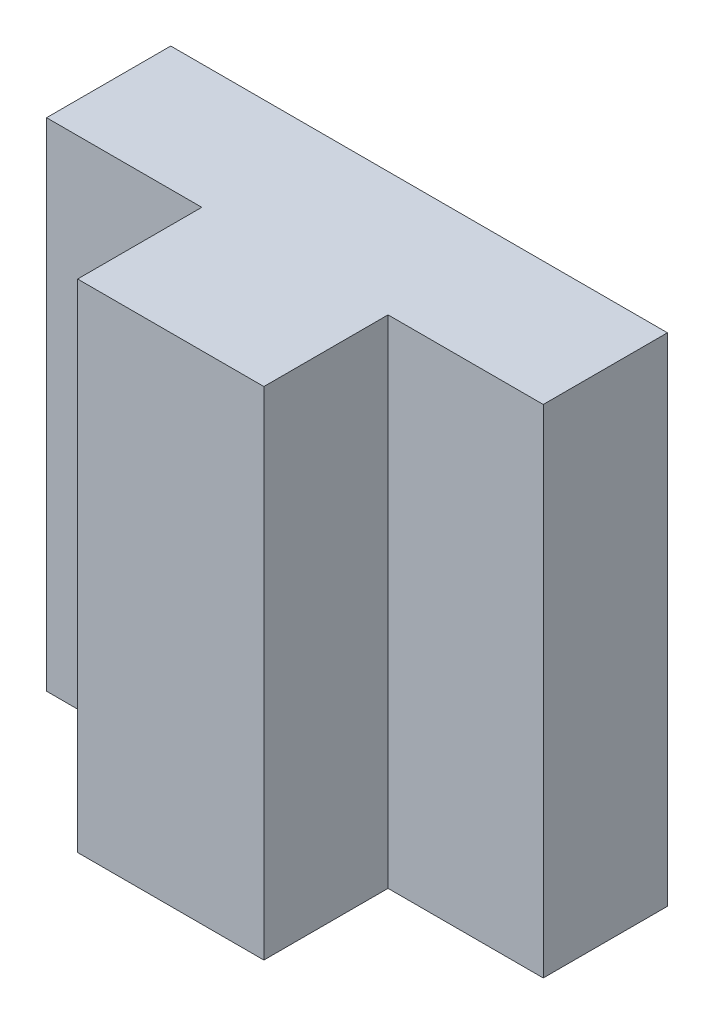
ISO-10303-21;
HEADER;
FILE_DESCRIPTION(('STEP AP214'),'2;1');
FILE_NAME('part.step','',(''),(''),'','','');
FILE_SCHEMA(('AUTOMOTIVE_DESIGN { 1 0 10303 214 1 1 1 1 }'));
ENDSEC;
DATA;
#1=APPLICATION_CONTEXT('core data for automotive mechanical design processes');
#2=APPLICATION_PROTOCOL_DEFINITION('international standard','automotive_design',2000,#1);
#3=PRODUCT_CONTEXT('',#1,'mechanical');
#4=PRODUCT('Part','Part','',(#3));
#5=PRODUCT_RELATED_PRODUCT_CATEGORY('part','',(#4));
#6=PRODUCT_DEFINITION_FORMATION('','',#4);
#7=PRODUCT_DEFINITION_CONTEXT('part definition',#1,'design');
#8=PRODUCT_DEFINITION('design','',#6,#7);
#9=PRODUCT_DEFINITION_SHAPE('','',#8);
#10=(LENGTH_UNIT() NAMED_UNIT(*) SI_UNIT(.MILLI.,.METRE.));
#11=(NAMED_UNIT(*) PLANE_ANGLE_UNIT() SI_UNIT($,.RADIAN.));
#12=(NAMED_UNIT(*) SI_UNIT($,.STERADIAN.) SOLID_ANGLE_UNIT());
#13=UNCERTAINTY_MEASURE_WITH_UNIT(LENGTH_MEASURE(1.E-05),#10,'distance_accuracy_value','');
#14=(GEOMETRIC_REPRESENTATION_CONTEXT(3) GLOBAL_UNCERTAINTY_ASSIGNED_CONTEXT((#13)) GLOBAL_UNIT_ASSIGNED_CONTEXT((#10,
#11,#12)) REPRESENTATION_CONTEXT('',''));
#15=CARTESIAN_POINT('',(0.,0.,0.));
#16=DIRECTION('',(0.,0.,1.));
#17=DIRECTION('',(1.,0.,0.));
#18=AXIS2_PLACEMENT_3D('',#15,#16,#17);
#19=CARTESIAN_POINT('',(0.,80.,0.));
#20=DIRECTION('',(1.,0.,0.));
#21=DIRECTION('',(0.,0.,-1.));
#22=AXIS2_PLACEMENT_3D('',#19,#20,#21);
#23=PLANE('',#22);
#24=DIRECTION('',(0.,0.,1.));
#25=VECTOR('',#24,1.);
#26=CARTESIAN_POINT('',(0.,0.,0.));
#27=LINE('',#26,#25);
#28=CARTESIAN_POINT('',(0.,0.,0.));
#29=VERTEX_POINT('',#28);
#30=CARTESIAN_POINT('',(0.,0.,20.));
#31=VERTEX_POINT('',#30);
#32=EDGE_CURVE('E129',#29,#31,#27,.T.);
#33=ORIENTED_EDGE('',*,*,#32,.T.);
#34=DIRECTION('',(0.,-1.,0.));
#35=VECTOR('',#34,1.);
#36=CARTESIAN_POINT('',(0.,80.,20.));
#37=LINE('',#36,#35);
#38=CARTESIAN_POINT('',(0.,80.,20.));
#39=VERTEX_POINT('',#38);
#40=EDGE_CURVE('E11',#39,#31,#37,.T.);
#41=ORIENTED_EDGE('',*,*,#40,.F.);
#42=DIRECTION('',(0.,0.,1.));
#43=VECTOR('',#42,1.);
#44=CARTESIAN_POINT('',(0.,80.,0.));
#45=LINE('',#44,#43);
#46=CARTESIAN_POINT('',(0.,80.,0.));
#47=VERTEX_POINT('',#46);
#48=EDGE_CURVE('E143',#47,#39,#45,.T.);
#49=ORIENTED_EDGE('',*,*,#48,.F.);
#50=DIRECTION('',(0.,-1.,0.));
#51=VECTOR('',#50,1.);
#52=CARTESIAN_POINT('',(0.,80.,0.));
#53=LINE('',#52,#51);
#54=EDGE_CURVE('E125',#47,#29,#53,.T.);
#55=ORIENTED_EDGE('',*,*,#54,.T.);
#56=EDGE_LOOP('',(#33,#41,#49,#55));
#57=FACE_BOUND('',#56,.T.);
#58=ADVANCED_FACE('F33',(#57),#23,.F.);
#59=CARTESIAN_POINT('',(0.,80.,20.));
#60=DIRECTION('',(0.,0.,-1.));
#61=DIRECTION('',(-1.,0.,0.));
#62=AXIS2_PLACEMENT_3D('',#59,#60,#61);
#63=PLANE('',#62);
#64=DIRECTION('',(1.,0.,0.));
#65=VECTOR('',#64,1.);
#66=CARTESIAN_POINT('',(0.,0.,20.));
#67=LINE('',#66,#65);
#68=CARTESIAN_POINT('',(25.,0.,20.));
#69=VERTEX_POINT('',#68);
#70=EDGE_CURVE('E132',#31,#69,#67,.T.);
#71=ORIENTED_EDGE('',*,*,#70,.T.);
#72=DIRECTION('',(0.,-1.,0.));
#73=VECTOR('',#72,1.);
#74=CARTESIAN_POINT('',(25.,80.,20.));
#75=LINE('',#74,#73);
#76=CARTESIAN_POINT('',(25.,80.,20.));
#77=VERTEX_POINT('',#76);
#78=EDGE_CURVE('E41',#77,#69,#75,.T.);
#79=ORIENTED_EDGE('',*,*,#78,.F.);
#80=DIRECTION('',(1.,0.,0.));
#81=VECTOR('',#80,1.);
#82=CARTESIAN_POINT('',(0.,80.,20.));
#83=LINE('',#82,#81);
#84=EDGE_CURVE('E92',#39,#77,#83,.T.);
#85=ORIENTED_EDGE('',*,*,#84,.F.);
#86=ORIENTED_EDGE('',*,*,#40,.T.);
#87=EDGE_LOOP('',(#71,#79,#85,#86));
#88=FACE_BOUND('',#87,.T.);
#89=ADVANCED_FACE('F178',(#88),#63,.F.);
#90=CARTESIAN_POINT('',(25.,80.,40.));
#91=DIRECTION('',(1.,0.,0.));
#92=DIRECTION('',(0.,0.,-1.));
#93=AXIS2_PLACEMENT_3D('',#90,#91,#92);
#94=PLANE('',#93);
#95=DIRECTION('',(0.,0.,1.));
#96=VECTOR('',#95,1.);
#97=CARTESIAN_POINT('',(25.,0.,40.));
#98=LINE('',#97,#96);
#99=CARTESIAN_POINT('',(25.,0.,40.));
#100=VERTEX_POINT('',#99);
#101=EDGE_CURVE('E134',#69,#100,#98,.T.);
#102=ORIENTED_EDGE('',*,*,#101,.T.);
#103=DIRECTION('',(0.,-1.,0.));
#104=VECTOR('',#103,1.);
#105=CARTESIAN_POINT('',(25.,80.,40.));
#106=LINE('',#105,#104);
#107=CARTESIAN_POINT('',(25.,80.,40.));
#108=VERTEX_POINT('',#107);
#109=EDGE_CURVE('E150',#108,#100,#106,.T.);
#110=ORIENTED_EDGE('',*,*,#109,.F.);
#111=DIRECTION('',(0.,0.,1.));
#112=VECTOR('',#111,1.);
#113=CARTESIAN_POINT('',(25.,80.,40.));
#114=LINE('',#113,#112);
#115=EDGE_CURVE('E158',#77,#108,#114,.T.);
#116=ORIENTED_EDGE('',*,*,#115,.F.);
#117=ORIENTED_EDGE('',*,*,#78,.T.);
#118=EDGE_LOOP('',(#102,#110,#116,#117));
#119=FACE_BOUND('',#118,.T.);
#120=ADVANCED_FACE('F156',(#119),#94,.F.);
#121=CARTESIAN_POINT('',(25.,80.,40.));
#122=DIRECTION('',(0.,0.,-1.));
#123=DIRECTION('',(-1.,0.,0.));
#124=AXIS2_PLACEMENT_3D('',#121,#122,#123);
#125=PLANE('',#124);
#126=DIRECTION('',(1.,0.,0.));
#127=VECTOR('',#126,1.);
#128=CARTESIAN_POINT('',(25.,0.,40.));
#129=LINE('',#128,#127);
#130=CARTESIAN_POINT('',(55.,0.,40.));
#131=VERTEX_POINT('',#130);
#132=EDGE_CURVE('E136',#100,#131,#129,.T.);
#133=ORIENTED_EDGE('',*,*,#132,.T.);
#134=DIRECTION('',(0.,-1.,0.));
#135=VECTOR('',#134,1.);
#136=CARTESIAN_POINT('',(55.,80.,40.));
#137=LINE('',#136,#135);
#138=CARTESIAN_POINT('',(55.,80.,40.));
#139=VERTEX_POINT('',#138);
#140=EDGE_CURVE('E147',#139,#131,#137,.T.);
#141=ORIENTED_EDGE('',*,*,#140,.F.);
#142=DIRECTION('',(1.,0.,0.));
#143=VECTOR('',#142,1.);
#144=CARTESIAN_POINT('',(25.,80.,40.));
#145=LINE('',#144,#143);
#146=EDGE_CURVE('E170',#108,#139,#145,.T.);
#147=ORIENTED_EDGE('',*,*,#146,.F.);
#148=ORIENTED_EDGE('',*,*,#109,.T.);
#149=EDGE_LOOP('',(#133,#141,#147,#148));
#150=FACE_BOUND('',#149,.T.);
#151=ADVANCED_FACE('F166',(#150),#125,.F.);
#152=CARTESIAN_POINT('',(55.,80.,40.));
#153=DIRECTION('',(-1.,0.,0.));
#154=DIRECTION('',(0.,0.,1.));
#155=AXIS2_PLACEMENT_3D('',#152,#153,#154);
#156=PLANE('',#155);
#157=DIRECTION('',(0.,0.,-1.));
#158=VECTOR('',#157,1.);
#159=CARTESIAN_POINT('',(55.,0.,40.));
#160=LINE('',#159,#158);
#161=CARTESIAN_POINT('',(55.,0.,20.));
#162=VERTEX_POINT('',#161);
#163=EDGE_CURVE('E138',#131,#162,#160,.T.);
#164=ORIENTED_EDGE('',*,*,#163,.T.);
#165=DIRECTION('',(0.,-1.,0.));
#166=VECTOR('',#165,1.);
#167=CARTESIAN_POINT('',(55.,80.,20.));
#168=LINE('',#167,#166);
#169=CARTESIAN_POINT('',(55.,80.,20.));
#170=VERTEX_POINT('',#169);
#171=EDGE_CURVE('E120',#170,#162,#168,.T.);
#172=ORIENTED_EDGE('',*,*,#171,.F.);
#173=DIRECTION('',(0.,0.,-1.));
#174=VECTOR('',#173,1.);
#175=CARTESIAN_POINT('',(55.,80.,40.));
#176=LINE('',#175,#174);
#177=EDGE_CURVE('E111',#139,#170,#176,.T.);
#178=ORIENTED_EDGE('',*,*,#177,.F.);
#179=ORIENTED_EDGE('',*,*,#140,.T.);
#180=EDGE_LOOP('',(#164,#172,#178,#179));
#181=FACE_BOUND('',#180,.T.);
#182=ADVANCED_FACE('F169',(#181),#156,.F.);
#183=CARTESIAN_POINT('',(80.,80.,20.));
#184=DIRECTION('',(0.,0.,-1.));
#185=DIRECTION('',(-1.,0.,0.));
#186=AXIS2_PLACEMENT_3D('',#183,#184,#185);
#187=PLANE('',#186);
#188=DIRECTION('',(1.,0.,0.));
#189=VECTOR('',#188,1.);
#190=CARTESIAN_POINT('',(80.,0.,20.));
#191=LINE('',#190,#189);
#192=CARTESIAN_POINT('',(80.,0.,20.));
#193=VERTEX_POINT('',#192);
#194=EDGE_CURVE('E119',#162,#193,#191,.T.);
#195=ORIENTED_EDGE('',*,*,#194,.T.);
#196=DIRECTION('',(0.,-1.,0.));
#197=VECTOR('',#196,1.);
#198=CARTESIAN_POINT('',(80.,80.,20.));
#199=LINE('',#198,#197);
#200=CARTESIAN_POINT('',(80.,80.,20.));
#201=VERTEX_POINT('',#200);
#202=EDGE_CURVE('E116',#201,#193,#199,.T.);
#203=ORIENTED_EDGE('',*,*,#202,.F.);
#204=DIRECTION('',(1.,0.,0.));
#205=VECTOR('',#204,1.);
#206=CARTESIAN_POINT('',(80.,80.,20.));
#207=LINE('',#206,#205);
#208=EDGE_CURVE('E105',#170,#201,#207,.T.);
#209=ORIENTED_EDGE('',*,*,#208,.F.);
#210=ORIENTED_EDGE('',*,*,#171,.T.);
#211=EDGE_LOOP('',(#195,#203,#209,#210));
#212=FACE_BOUND('',#211,.T.);
#213=ADVANCED_FACE('F117',(#212),#187,.F.);
#214=CARTESIAN_POINT('',(80.,80.,0.));
#215=DIRECTION('',(-1.,0.,0.));
#216=DIRECTION('',(0.,0.,1.));
#217=AXIS2_PLACEMENT_3D('',#214,#215,#216);
#218=PLANE('',#217);
#219=DIRECTION('',(0.,0.,-1.));
#220=VECTOR('',#219,1.);
#221=CARTESIAN_POINT('',(80.,0.,0.));
#222=LINE('',#221,#220);
#223=CARTESIAN_POINT('',(80.,0.,0.));
#224=VERTEX_POINT('',#223);
#225=EDGE_CURVE('E78',#193,#224,#222,.T.);
#226=ORIENTED_EDGE('',*,*,#225,.T.);
#227=DIRECTION('',(0.,-1.,0.));
#228=VECTOR('',#227,1.);
#229=CARTESIAN_POINT('',(80.,80.,0.));
#230=LINE('',#229,#228);
#231=CARTESIAN_POINT('',(80.,80.,0.));
#232=VERTEX_POINT('',#231);
#233=EDGE_CURVE('E121',#232,#224,#230,.T.);
#234=ORIENTED_EDGE('',*,*,#233,.F.);
#235=DIRECTION('',(0.,0.,-1.));
#236=VECTOR('',#235,1.);
#237=CARTESIAN_POINT('',(80.,80.,0.));
#238=LINE('',#237,#236);
#239=EDGE_CURVE('E109',#201,#232,#238,.T.);
#240=ORIENTED_EDGE('',*,*,#239,.F.);
#241=ORIENTED_EDGE('',*,*,#202,.T.);
#242=EDGE_LOOP('',(#226,#234,#240,#241));
#243=FACE_BOUND('',#242,.T.);
#244=ADVANCED_FACE('F123',(#243),#218,.F.);
#245=CARTESIAN_POINT('',(0.,80.,0.));
#246=DIRECTION('',(0.,0.,1.));
#247=DIRECTION('',(1.,0.,0.));
#248=AXIS2_PLACEMENT_3D('',#245,#246,#247);
#249=PLANE('',#248);
#250=DIRECTION('',(-1.,0.,0.));
#251=VECTOR('',#250,1.);
#252=CARTESIAN_POINT('',(0.,0.,0.));
#253=LINE('',#252,#251);
#254=EDGE_CURVE('E84',#224,#29,#253,.T.);
#255=ORIENTED_EDGE('',*,*,#254,.T.);
#256=ORIENTED_EDGE('',*,*,#54,.F.);
#257=DIRECTION('',(-1.,0.,0.));
#258=VECTOR('',#257,1.);
#259=CARTESIAN_POINT('',(0.,80.,0.));
#260=LINE('',#259,#258);
#261=EDGE_CURVE('E49',#232,#47,#260,.T.);
#262=ORIENTED_EDGE('',*,*,#261,.F.);
#263=ORIENTED_EDGE('',*,*,#233,.T.);
#264=EDGE_LOOP('',(#255,#256,#262,#263));
#265=FACE_BOUND('',#264,.T.);
#266=ADVANCED_FACE('F194',(#265),#249,.F.);
#267=CARTESIAN_POINT('',(0.,80.,0.));
#268=DIRECTION('',(0.,1.,0.));
#269=DIRECTION('',(0.,0.,1.));
#270=AXIS2_PLACEMENT_3D('',#267,#268,#269);
#271=PLANE('',#270);
#272=ORIENTED_EDGE('',*,*,#48,.T.);
#273=ORIENTED_EDGE('',*,*,#84,.T.);
#274=ORIENTED_EDGE('',*,*,#115,.T.);
#275=ORIENTED_EDGE('',*,*,#146,.T.);
#276=ORIENTED_EDGE('',*,*,#177,.T.);
#277=ORIENTED_EDGE('',*,*,#208,.T.);
#278=ORIENTED_EDGE('',*,*,#239,.T.);
#279=ORIENTED_EDGE('',*,*,#261,.T.);
#280=EDGE_LOOP('',(#272,#273,#274,#275,#276,#277,#278,#279));
#281=FACE_BOUND('',#280,.T.);
#282=ADVANCED_FACE('F107',(#281),#271,.T.);
#283=CARTESIAN_POINT('',(0.,0.,0.));
#284=DIRECTION('',(0.,1.,0.));
#285=DIRECTION('',(0.,0.,1.));
#286=AXIS2_PLACEMENT_3D('',#283,#284,#285);
#287=PLANE('',#286);
#288=ORIENTED_EDGE('',*,*,#32,.F.);
#289=ORIENTED_EDGE('',*,*,#254,.F.);
#290=ORIENTED_EDGE('',*,*,#225,.F.);
#291=ORIENTED_EDGE('',*,*,#194,.F.);
#292=ORIENTED_EDGE('',*,*,#163,.F.);
#293=ORIENTED_EDGE('',*,*,#132,.F.);
#294=ORIENTED_EDGE('',*,*,#101,.F.);
#295=ORIENTED_EDGE('',*,*,#70,.F.);
#296=EDGE_LOOP('',(#288,#289,#290,#291,#292,#293,#294,#295));
#297=FACE_BOUND('',#296,.T.);
#298=ADVANCED_FACE('F162',(#297),#287,.F.);
#299=CLOSED_SHELL('',(#58,#89,#120,#151,#182,#213,#244,#266,#282,#298));
#300=MANIFOLD_SOLID_BREP('B2',#299);
#301=ADVANCED_BREP_SHAPE_REPRESENTATION('',(#18,#300),#14);
#302=SHAPE_DEFINITION_REPRESENTATION(#9,#301);
ENDSEC;
END-ISO-10303-21;
